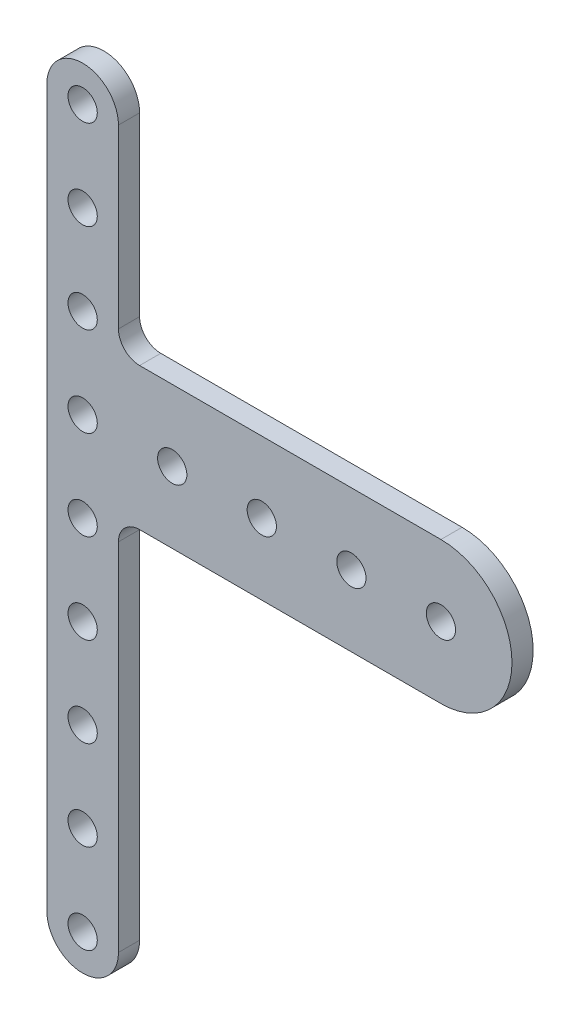
ISO-10303-21;
HEADER;
FILE_DESCRIPTION(('STEP AP214'),'2;1');
FILE_NAME('part.step','',(''),(''),'','','');
FILE_SCHEMA(('AUTOMOTIVE_DESIGN { 1 0 10303 214 1 1 1 1 }'));
ENDSEC;
DATA;
#1=APPLICATION_CONTEXT('core data for automotive mechanical design processes');
#2=APPLICATION_PROTOCOL_DEFINITION('international standard','automotive_design',2000,#1);
#3=PRODUCT_CONTEXT('',#1,'mechanical');
#4=PRODUCT('Part','Part','',(#3));
#5=PRODUCT_RELATED_PRODUCT_CATEGORY('part','',(#4));
#6=PRODUCT_DEFINITION_FORMATION('','',#4);
#7=PRODUCT_DEFINITION_CONTEXT('part definition',#1,'design');
#8=PRODUCT_DEFINITION('design','',#6,#7);
#9=PRODUCT_DEFINITION_SHAPE('','',#8);
#10=(LENGTH_UNIT() NAMED_UNIT(*) SI_UNIT(.MILLI.,.METRE.));
#11=(NAMED_UNIT(*) PLANE_ANGLE_UNIT() SI_UNIT($,.RADIAN.));
#12=(NAMED_UNIT(*) SI_UNIT($,.STERADIAN.) SOLID_ANGLE_UNIT());
#13=UNCERTAINTY_MEASURE_WITH_UNIT(LENGTH_MEASURE(1.E-05),#10,'distance_accuracy_value','');
#14=(GEOMETRIC_REPRESENTATION_CONTEXT(3) GLOBAL_UNCERTAINTY_ASSIGNED_CONTEXT((#13)) GLOBAL_UNIT_ASSIGNED_CONTEXT((#10,
#11,#12)) REPRESENTATION_CONTEXT('',''));
#15=CARTESIAN_POINT('',(0.,0.,0.));
#16=DIRECTION('',(0.,0.,1.));
#17=DIRECTION('',(1.,0.,0.));
#18=AXIS2_PLACEMENT_3D('',#15,#16,#17);
#19=CARTESIAN_POINT('',(-1.30692486857548E-13,38.1,1.5));
#20=DIRECTION('',(0.,0.,1.));
#21=DIRECTION('',(1.,0.,0.));
#22=AXIS2_PLACEMENT_3D('',#19,#20,#21);
#23=PLANE('',#22);
#24=CARTESIAN_POINT('',(5.28991153169859E-13,-50.8,1.5));
#25=DIRECTION('',(0.,0.,1.));
#26=DIRECTION('',(1.,0.,0.));
#27=AXIS2_PLACEMENT_3D('',#24,#25,#26);
#28=CIRCLE('',#27,2.075);
#29=CARTESIAN_POINT('',(2.07500000000053,-50.8,1.5));
#30=VERTEX_POINT('',#29);
#31=EDGE_CURVE('E287',#30,#30,#28,.T.);
#32=ORIENTED_EDGE('',*,*,#31,.F.);
#33=EDGE_LOOP('',(#32));
#34=FACE_BOUND('',#33,.T.);
#35=CARTESIAN_POINT('',(2.6449557658493E-13,-25.4,1.5));
#36=DIRECTION('',(0.,0.,1.));
#37=DIRECTION('',(1.,0.,0.));
#38=AXIS2_PLACEMENT_3D('',#35,#36,#37);
#39=CIRCLE('',#38,2.075);
#40=CARTESIAN_POINT('',(2.07500000000026,-25.4,1.5));
#41=VERTEX_POINT('',#40);
#42=EDGE_CURVE('E275',#41,#41,#39,.T.);
#43=ORIENTED_EDGE('',*,*,#42,.F.);
#44=EDGE_LOOP('',(#43));
#45=FACE_BOUND('',#44,.T.);
#46=CARTESIAN_POINT('',(-1.30692486857548E-13,38.1,1.5));
#47=DIRECTION('',(0.,0.,1.));
#48=DIRECTION('',(1.,0.,0.));
#49=AXIS2_PLACEMENT_3D('',#46,#47,#48);
#50=CIRCLE('',#49,2.075);
#51=CARTESIAN_POINT('',(2.07499999999987,38.1,1.5));
#52=VERTEX_POINT('',#51);
#53=EDGE_CURVE('E263',#52,#52,#50,.T.);
#54=ORIENTED_EDGE('',*,*,#53,.F.);
#55=EDGE_LOOP('',(#54));
#56=FACE_BOUND('',#55,.T.);
#57=CARTESIAN_POINT('',(0.,12.7,1.5));
#58=DIRECTION('',(0.,0.,1.));
#59=DIRECTION('',(1.,0.,0.));
#60=AXIS2_PLACEMENT_3D('',#57,#58,#59);
#61=CIRCLE('',#60,2.075);
#62=CARTESIAN_POINT('',(2.07499999999996,12.7,1.5));
#63=VERTEX_POINT('',#62);
#64=EDGE_CURVE('E251',#63,#63,#61,.T.);
#65=ORIENTED_EDGE('',*,*,#64,.F.);
#66=EDGE_LOOP('',(#65));
#67=FACE_BOUND('',#66,.T.);
#68=CARTESIAN_POINT('',(38.1,0.,1.5));
#69=DIRECTION('',(0.,0.,1.));
#70=DIRECTION('',(1.,0.,0.));
#71=AXIS2_PLACEMENT_3D('',#68,#69,#70);
#72=CIRCLE('',#71,2.075);
#73=CARTESIAN_POINT('',(40.175,0.,1.5));
#74=VERTEX_POINT('',#73);
#75=EDGE_CURVE('E239',#74,#74,#72,.T.);
#76=ORIENTED_EDGE('',*,*,#75,.F.);
#77=EDGE_LOOP('',(#76));
#78=FACE_BOUND('',#77,.T.);
#79=CARTESIAN_POINT('',(12.7,0.,1.5));
#80=DIRECTION('',(0.,0.,1.));
#81=DIRECTION('',(1.,0.,0.));
#82=AXIS2_PLACEMENT_3D('',#79,#80,#81);
#83=CIRCLE('',#82,2.075);
#84=CARTESIAN_POINT('',(14.775,0.,1.5));
#85=VERTEX_POINT('',#84);
#86=EDGE_CURVE('E227',#85,#85,#83,.T.);
#87=ORIENTED_EDGE('',*,*,#86,.F.);
#88=EDGE_LOOP('',(#87));
#89=FACE_BOUND('',#88,.T.);
#90=CARTESIAN_POINT('',(-1.30692486857548E-13,38.1,1.5));
#91=DIRECTION('',(0.,0.,1.));
#92=DIRECTION('',(1.,0.,0.));
#93=AXIS2_PLACEMENT_3D('',#90,#91,#92);
#94=CIRCLE('',#93,5.075);
#95=CARTESIAN_POINT('',(5.07499999999987,38.1,1.5));
#96=VERTEX_POINT('',#95);
#97=CARTESIAN_POINT('',(-5.07500000000013,38.1,1.5));
#98=VERTEX_POINT('',#97);
#99=EDGE_CURVE('E125',#96,#98,#94,.T.);
#100=ORIENTED_EDGE('',*,*,#99,.T.);
#101=DIRECTION('',(0.,-1.,0.));
#102=VECTOR('',#101,1.);
#103=CARTESIAN_POINT('',(-5.07500000000013,38.1,1.5));
#104=LINE('',#103,#102);
#105=CARTESIAN_POINT('',(-5.07499999999934,-63.5,1.5));
#106=VERTEX_POINT('',#105);
#107=EDGE_CURVE('E114',#98,#106,#104,.T.);
#108=ORIENTED_EDGE('',*,*,#107,.T.);
#109=CARTESIAN_POINT('',(6.61238941462324E-13,-63.5,1.5));
#110=DIRECTION('',(0.,0.,1.));
#111=DIRECTION('',(1.,0.,0.));
#112=AXIS2_PLACEMENT_3D('',#109,#110,#111);
#113=CIRCLE('',#112,5.075);
#114=CARTESIAN_POINT('',(5.07500000000066,-63.5,1.5));
#115=VERTEX_POINT('',#114);
#116=EDGE_CURVE('E124',#106,#115,#113,.T.);
#117=ORIENTED_EDGE('',*,*,#116,.T.);
#118=DIRECTION('',(0.,1.,0.));
#119=VECTOR('',#118,1.);
#120=CARTESIAN_POINT('',(5.07500000000066,-63.5,1.5));
#121=LINE('',#120,#119);
#122=CARTESIAN_POINT('',(5.07500000000027,-13.075,1.5));
#123=VERTEX_POINT('',#122);
#124=EDGE_CURVE('E162',#115,#123,#121,.T.);
#125=ORIENTED_EDGE('',*,*,#124,.T.);
#126=CARTESIAN_POINT('',(8.07500000000027,-13.075,1.5));
#127=DIRECTION('',(0.,0.,1.));
#128=DIRECTION('',(1.,0.,0.));
#129=AXIS2_PLACEMENT_3D('',#126,#127,#128);
#130=CIRCLE('',#129,3.);
#131=CARTESIAN_POINT('',(8.07500000000027,-10.075,1.5));
#132=VERTEX_POINT('',#131);
#133=EDGE_CURVE('E155',#123,#132,#130,.F.);
#134=ORIENTED_EDGE('',*,*,#133,.T.);
#135=DIRECTION('',(1.,0.,0.));
#136=VECTOR('',#135,1.);
#137=CARTESIAN_POINT('',(50.8,-10.075,1.5));
#138=LINE('',#137,#136);
#139=CARTESIAN_POINT('',(50.8,-10.075,1.5));
#140=VERTEX_POINT('',#139);
#141=EDGE_CURVE('E159',#132,#140,#138,.T.);
#142=ORIENTED_EDGE('',*,*,#141,.T.);
#143=CARTESIAN_POINT('',(50.8,0.,1.5));
#144=DIRECTION('',(0.,0.,1.));
#145=DIRECTION('',(1.,0.,0.));
#146=AXIS2_PLACEMENT_3D('',#143,#144,#145);
#147=CIRCLE('',#146,10.075);
#148=CARTESIAN_POINT('',(50.8,10.075,1.5));
#149=VERTEX_POINT('',#148);
#150=EDGE_CURVE('E172',#140,#149,#147,.T.);
#151=ORIENTED_EDGE('',*,*,#150,.T.);
#152=DIRECTION('',(-1.,0.,0.));
#153=VECTOR('',#152,1.);
#154=CARTESIAN_POINT('',(50.8,10.075,1.5));
#155=LINE('',#154,#153);
#156=CARTESIAN_POINT('',(8.07500000000007,10.075,1.5));
#157=VERTEX_POINT('',#156);
#158=EDGE_CURVE('E211',#149,#157,#155,.T.);
#159=ORIENTED_EDGE('',*,*,#158,.T.);
#160=CARTESIAN_POINT('',(8.07500000000007,13.075,1.5));
#161=DIRECTION('',(0.,0.,1.));
#162=DIRECTION('',(1.,0.,0.));
#163=AXIS2_PLACEMENT_3D('',#160,#161,#162);
#164=CIRCLE('',#163,3.);
#165=CARTESIAN_POINT('',(5.07500000000007,13.075,1.5));
#166=VERTEX_POINT('',#165);
#167=EDGE_CURVE('E11',#157,#166,#164,.F.);
#168=ORIENTED_EDGE('',*,*,#167,.T.);
#169=DIRECTION('',(0.,1.,0.));
#170=VECTOR('',#169,1.);
#171=CARTESIAN_POINT('',(5.07500000000009,10.075,1.5));
#172=LINE('',#171,#170);
#173=EDGE_CURVE('E130',#166,#96,#172,.T.);
#174=ORIENTED_EDGE('',*,*,#173,.T.);
#175=EDGE_LOOP('',(#100,#108,#117,#125,#134,#142,#151,#159,#168,#174));
#176=FACE_BOUND('',#175,.T.);
#177=CARTESIAN_POINT('',(0.,0.,1.5));
#178=DIRECTION('',(0.,0.,1.));
#179=DIRECTION('',(1.,0.,0.));
#180=AXIS2_PLACEMENT_3D('',#177,#178,#179);
#181=CIRCLE('',#180,2.075);
#182=CARTESIAN_POINT('',(2.075,0.,1.5));
#183=VERTEX_POINT('',#182);
#184=EDGE_CURVE('E218',#183,#183,#181,.T.);
#185=ORIENTED_EDGE('',*,*,#184,.F.);
#186=EDGE_LOOP('',(#185));
#187=FACE_BOUND('',#186,.T.);
#188=CARTESIAN_POINT('',(25.4,0.,1.5));
#189=DIRECTION('',(0.,0.,1.));
#190=DIRECTION('',(1.,0.,0.));
#191=AXIS2_PLACEMENT_3D('',#188,#189,#190);
#192=CIRCLE('',#191,2.075);
#193=CARTESIAN_POINT('',(27.475,0.,1.5));
#194=VERTEX_POINT('',#193);
#195=EDGE_CURVE('E233',#194,#194,#192,.T.);
#196=ORIENTED_EDGE('',*,*,#195,.F.);
#197=EDGE_LOOP('',(#196));
#198=FACE_BOUND('',#197,.T.);
#199=CARTESIAN_POINT('',(50.8,0.,1.5));
#200=DIRECTION('',(0.,0.,1.));
#201=DIRECTION('',(1.,0.,0.));
#202=AXIS2_PLACEMENT_3D('',#199,#200,#201);
#203=CIRCLE('',#202,2.075);
#204=CARTESIAN_POINT('',(52.875,0.,1.5));
#205=VERTEX_POINT('',#204);
#206=EDGE_CURVE('E245',#205,#205,#203,.T.);
#207=ORIENTED_EDGE('',*,*,#206,.F.);
#208=EDGE_LOOP('',(#207));
#209=FACE_BOUND('',#208,.T.);
#210=CARTESIAN_POINT('',(0.,25.4,1.5));
#211=DIRECTION('',(0.,0.,1.));
#212=DIRECTION('',(1.,0.,0.));
#213=AXIS2_PLACEMENT_3D('',#210,#211,#212);
#214=CIRCLE('',#213,2.075);
#215=CARTESIAN_POINT('',(2.07499999999991,25.4,1.5));
#216=VERTEX_POINT('',#215);
#217=EDGE_CURVE('E257',#216,#216,#214,.T.);
#218=ORIENTED_EDGE('',*,*,#217,.F.);
#219=EDGE_LOOP('',(#218));
#220=FACE_BOUND('',#219,.T.);
#221=CARTESIAN_POINT('',(1.32247788292465E-13,-12.7,1.5));
#222=DIRECTION('',(0.,0.,1.));
#223=DIRECTION('',(1.,0.,0.));
#224=AXIS2_PLACEMENT_3D('',#221,#222,#223);
#225=CIRCLE('',#224,2.075);
#226=CARTESIAN_POINT('',(2.07500000000013,-12.7,1.5));
#227=VERTEX_POINT('',#226);
#228=EDGE_CURVE('E269',#227,#227,#225,.T.);
#229=ORIENTED_EDGE('',*,*,#228,.F.);
#230=EDGE_LOOP('',(#229));
#231=FACE_BOUND('',#230,.T.);
#232=CARTESIAN_POINT('',(3.96743364877394E-13,-38.1,1.5));
#233=DIRECTION('',(0.,0.,1.));
#234=DIRECTION('',(1.,0.,0.));
#235=AXIS2_PLACEMENT_3D('',#232,#233,#234);
#236=CIRCLE('',#235,2.075);
#237=CARTESIAN_POINT('',(2.0750000000004,-38.1,1.5));
#238=VERTEX_POINT('',#237);
#239=EDGE_CURVE('E281',#238,#238,#236,.T.);
#240=ORIENTED_EDGE('',*,*,#239,.F.);
#241=EDGE_LOOP('',(#240));
#242=FACE_BOUND('',#241,.T.);
#243=CARTESIAN_POINT('',(6.61238941462324E-13,-63.5,1.5));
#244=DIRECTION('',(0.,0.,1.));
#245=DIRECTION('',(1.,0.,0.));
#246=AXIS2_PLACEMENT_3D('',#243,#244,#245);
#247=CIRCLE('',#246,2.075);
#248=CARTESIAN_POINT('',(2.07500000000066,-63.5,1.5));
#249=VERTEX_POINT('',#248);
#250=EDGE_CURVE('E293',#249,#249,#247,.T.);
#251=ORIENTED_EDGE('',*,*,#250,.F.);
#252=EDGE_LOOP('',(#251));
#253=FACE_BOUND('',#252,.T.);
#254=ADVANCED_FACE('F37',(#34,#45,#56,#67,#78,#89,#176,#187,#198,#209,#220,#231,#242,#253),#23,.T.);
#255=CARTESIAN_POINT('',(-1.30692486857548E-13,38.1,-1.5));
#256=DIRECTION('',(0.,0.,1.));
#257=DIRECTION('',(1.,0.,0.));
#258=AXIS2_PLACEMENT_3D('',#255,#256,#257);
#259=PLANE('',#258);
#260=CARTESIAN_POINT('',(-1.30692486857548E-13,38.1,-1.5));
#261=DIRECTION('',(0.,0.,1.));
#262=DIRECTION('',(1.,0.,0.));
#263=AXIS2_PLACEMENT_3D('',#260,#261,#262);
#264=CIRCLE('',#263,5.075);
#265=CARTESIAN_POINT('',(5.07499999999987,38.1,-1.5));
#266=VERTEX_POINT('',#265);
#267=CARTESIAN_POINT('',(-5.07500000000013,38.1,-1.5));
#268=VERTEX_POINT('',#267);
#269=EDGE_CURVE('E138',#266,#268,#264,.T.);
#270=ORIENTED_EDGE('',*,*,#269,.F.);
#271=DIRECTION('',(0.,1.,0.));
#272=VECTOR('',#271,1.);
#273=CARTESIAN_POINT('',(5.07500000000009,10.075,-1.5));
#274=LINE('',#273,#272);
#275=CARTESIAN_POINT('',(5.07500000000007,13.075,-1.5));
#276=VERTEX_POINT('',#275);
#277=EDGE_CURVE('E134',#276,#266,#274,.T.);
#278=ORIENTED_EDGE('',*,*,#277,.F.);
#279=CARTESIAN_POINT('',(8.07500000000007,13.075,-1.5));
#280=DIRECTION('',(0.,0.,1.));
#281=DIRECTION('',(1.,0.,0.));
#282=AXIS2_PLACEMENT_3D('',#279,#280,#281);
#283=CIRCLE('',#282,3.);
#284=CARTESIAN_POINT('',(8.07500000000007,10.075,-1.5));
#285=VERTEX_POINT('',#284);
#286=EDGE_CURVE('E45',#276,#285,#283,.T.);
#287=ORIENTED_EDGE('',*,*,#286,.T.);
#288=DIRECTION('',(-1.,0.,0.));
#289=VECTOR('',#288,1.);
#290=CARTESIAN_POINT('',(50.8,10.075,-1.5));
#291=LINE('',#290,#289);
#292=CARTESIAN_POINT('',(50.8,10.075,-1.5));
#293=VERTEX_POINT('',#292);
#294=EDGE_CURVE('E196',#293,#285,#291,.T.);
#295=ORIENTED_EDGE('',*,*,#294,.F.);
#296=CARTESIAN_POINT('',(50.8,0.,-1.5));
#297=DIRECTION('',(0.,0.,1.));
#298=DIRECTION('',(1.,0.,0.));
#299=AXIS2_PLACEMENT_3D('',#296,#297,#298);
#300=CIRCLE('',#299,10.075);
#301=CARTESIAN_POINT('',(50.8,-10.075,-1.5));
#302=VERTEX_POINT('',#301);
#303=EDGE_CURVE('E189',#302,#293,#300,.T.);
#304=ORIENTED_EDGE('',*,*,#303,.F.);
#305=DIRECTION('',(1.,0.,0.));
#306=VECTOR('',#305,1.);
#307=CARTESIAN_POINT('',(50.8,-10.075,-1.5));
#308=LINE('',#307,#306);
#309=CARTESIAN_POINT('',(8.07500000000027,-10.075,-1.5));
#310=VERTEX_POINT('',#309);
#311=EDGE_CURVE('E182',#310,#302,#308,.T.);
#312=ORIENTED_EDGE('',*,*,#311,.F.);
#313=CARTESIAN_POINT('',(8.07500000000027,-13.075,-1.5));
#314=DIRECTION('',(0.,0.,1.));
#315=DIRECTION('',(1.,0.,0.));
#316=AXIS2_PLACEMENT_3D('',#313,#314,#315);
#317=CIRCLE('',#316,3.);
#318=CARTESIAN_POINT('',(5.07500000000027,-13.075,-1.5));
#319=VERTEX_POINT('',#318);
#320=EDGE_CURVE('E153',#310,#319,#317,.T.);
#321=ORIENTED_EDGE('',*,*,#320,.T.);
#322=DIRECTION('',(0.,1.,0.));
#323=VECTOR('',#322,1.);
#324=CARTESIAN_POINT('',(5.07500000000066,-63.5,-1.5));
#325=LINE('',#324,#323);
#326=CARTESIAN_POINT('',(5.07500000000066,-63.5,-1.5));
#327=VERTEX_POINT('',#326);
#328=EDGE_CURVE('E180',#327,#319,#325,.T.);
#329=ORIENTED_EDGE('',*,*,#328,.F.);
#330=CARTESIAN_POINT('',(6.61238941462324E-13,-63.5,-1.5));
#331=DIRECTION('',(0.,0.,1.));
#332=DIRECTION('',(1.,0.,0.));
#333=AXIS2_PLACEMENT_3D('',#330,#331,#332);
#334=CIRCLE('',#333,5.075);
#335=CARTESIAN_POINT('',(-5.07499999999934,-63.5,-1.5));
#336=VERTEX_POINT('',#335);
#337=EDGE_CURVE('E187',#336,#327,#334,.T.);
#338=ORIENTED_EDGE('',*,*,#337,.F.);
#339=DIRECTION('',(0.,-1.,0.));
#340=VECTOR('',#339,1.);
#341=CARTESIAN_POINT('',(-5.07500000000013,38.1,-1.5));
#342=LINE('',#341,#340);
#343=EDGE_CURVE('E191',#268,#336,#342,.T.);
#344=ORIENTED_EDGE('',*,*,#343,.F.);
#345=EDGE_LOOP('',(#270,#278,#287,#295,#304,#312,#321,#329,#338,#344));
#346=FACE_BOUND('',#345,.T.);
#347=CARTESIAN_POINT('',(0.,0.,-1.5));
#348=DIRECTION('',(0.,0.,1.));
#349=DIRECTION('',(1.,0.,0.));
#350=AXIS2_PLACEMENT_3D('',#347,#348,#349);
#351=CIRCLE('',#350,2.075);
#352=CARTESIAN_POINT('',(2.075,0.,-1.5));
#353=VERTEX_POINT('',#352);
#354=EDGE_CURVE('E224',#353,#353,#351,.T.);
#355=ORIENTED_EDGE('',*,*,#354,.T.);
#356=EDGE_LOOP('',(#355));
#357=FACE_BOUND('',#356,.T.);
#358=CARTESIAN_POINT('',(12.7,0.,-1.5));
#359=DIRECTION('',(0.,0.,1.));
#360=DIRECTION('',(1.,0.,0.));
#361=AXIS2_PLACEMENT_3D('',#358,#359,#360);
#362=CIRCLE('',#361,2.075);
#363=CARTESIAN_POINT('',(14.775,0.,-1.5));
#364=VERTEX_POINT('',#363);
#365=EDGE_CURVE('E230',#364,#364,#362,.T.);
#366=ORIENTED_EDGE('',*,*,#365,.T.);
#367=EDGE_LOOP('',(#366));
#368=FACE_BOUND('',#367,.T.);
#369=CARTESIAN_POINT('',(25.4,0.,-1.5));
#370=DIRECTION('',(0.,0.,1.));
#371=DIRECTION('',(1.,0.,0.));
#372=AXIS2_PLACEMENT_3D('',#369,#370,#371);
#373=CIRCLE('',#372,2.075);
#374=CARTESIAN_POINT('',(27.475,0.,-1.5));
#375=VERTEX_POINT('',#374);
#376=EDGE_CURVE('E236',#375,#375,#373,.T.);
#377=ORIENTED_EDGE('',*,*,#376,.T.);
#378=EDGE_LOOP('',(#377));
#379=FACE_BOUND('',#378,.T.);
#380=CARTESIAN_POINT('',(38.1,0.,-1.5));
#381=DIRECTION('',(0.,0.,1.));
#382=DIRECTION('',(1.,0.,0.));
#383=AXIS2_PLACEMENT_3D('',#380,#381,#382);
#384=CIRCLE('',#383,2.075);
#385=CARTESIAN_POINT('',(40.175,0.,-1.5));
#386=VERTEX_POINT('',#385);
#387=EDGE_CURVE('E242',#386,#386,#384,.T.);
#388=ORIENTED_EDGE('',*,*,#387,.T.);
#389=EDGE_LOOP('',(#388));
#390=FACE_BOUND('',#389,.T.);
#391=CARTESIAN_POINT('',(50.8,0.,-1.5));
#392=DIRECTION('',(0.,0.,1.));
#393=DIRECTION('',(1.,0.,0.));
#394=AXIS2_PLACEMENT_3D('',#391,#392,#393);
#395=CIRCLE('',#394,2.075);
#396=CARTESIAN_POINT('',(52.875,0.,-1.5));
#397=VERTEX_POINT('',#396);
#398=EDGE_CURVE('E248',#397,#397,#395,.T.);
#399=ORIENTED_EDGE('',*,*,#398,.T.);
#400=EDGE_LOOP('',(#399));
#401=FACE_BOUND('',#400,.T.);
#402=CARTESIAN_POINT('',(0.,12.7,-1.5));
#403=DIRECTION('',(0.,0.,1.));
#404=DIRECTION('',(1.,0.,0.));
#405=AXIS2_PLACEMENT_3D('',#402,#403,#404);
#406=CIRCLE('',#405,2.075);
#407=CARTESIAN_POINT('',(2.07499999999996,12.7,-1.5));
#408=VERTEX_POINT('',#407);
#409=EDGE_CURVE('E254',#408,#408,#406,.T.);
#410=ORIENTED_EDGE('',*,*,#409,.T.);
#411=EDGE_LOOP('',(#410));
#412=FACE_BOUND('',#411,.T.);
#413=CARTESIAN_POINT('',(0.,25.4,-1.5));
#414=DIRECTION('',(0.,0.,1.));
#415=DIRECTION('',(1.,0.,0.));
#416=AXIS2_PLACEMENT_3D('',#413,#414,#415);
#417=CIRCLE('',#416,2.075);
#418=CARTESIAN_POINT('',(2.07499999999991,25.4,-1.5));
#419=VERTEX_POINT('',#418);
#420=EDGE_CURVE('E260',#419,#419,#417,.T.);
#421=ORIENTED_EDGE('',*,*,#420,.T.);
#422=EDGE_LOOP('',(#421));
#423=FACE_BOUND('',#422,.T.);
#424=CARTESIAN_POINT('',(-1.30692486857548E-13,38.1,-1.5));
#425=DIRECTION('',(0.,0.,1.));
#426=DIRECTION('',(1.,0.,0.));
#427=AXIS2_PLACEMENT_3D('',#424,#425,#426);
#428=CIRCLE('',#427,2.075);
#429=CARTESIAN_POINT('',(2.07499999999987,38.1,-1.5));
#430=VERTEX_POINT('',#429);
#431=EDGE_CURVE('E266',#430,#430,#428,.T.);
#432=ORIENTED_EDGE('',*,*,#431,.T.);
#433=EDGE_LOOP('',(#432));
#434=FACE_BOUND('',#433,.T.);
#435=CARTESIAN_POINT('',(1.32247788292465E-13,-12.7,-1.5));
#436=DIRECTION('',(0.,0.,1.));
#437=DIRECTION('',(1.,0.,0.));
#438=AXIS2_PLACEMENT_3D('',#435,#436,#437);
#439=CIRCLE('',#438,2.075);
#440=CARTESIAN_POINT('',(2.07500000000013,-12.7,-1.5));
#441=VERTEX_POINT('',#440);
#442=EDGE_CURVE('E272',#441,#441,#439,.T.);
#443=ORIENTED_EDGE('',*,*,#442,.T.);
#444=EDGE_LOOP('',(#443));
#445=FACE_BOUND('',#444,.T.);
#446=CARTESIAN_POINT('',(2.6449557658493E-13,-25.4,-1.5));
#447=DIRECTION('',(0.,0.,1.));
#448=DIRECTION('',(1.,0.,0.));
#449=AXIS2_PLACEMENT_3D('',#446,#447,#448);
#450=CIRCLE('',#449,2.075);
#451=CARTESIAN_POINT('',(2.07500000000026,-25.4,-1.5));
#452=VERTEX_POINT('',#451);
#453=EDGE_CURVE('E278',#452,#452,#450,.T.);
#454=ORIENTED_EDGE('',*,*,#453,.T.);
#455=EDGE_LOOP('',(#454));
#456=FACE_BOUND('',#455,.T.);
#457=CARTESIAN_POINT('',(3.96743364877394E-13,-38.1,-1.5));
#458=DIRECTION('',(0.,0.,1.));
#459=DIRECTION('',(1.,0.,0.));
#460=AXIS2_PLACEMENT_3D('',#457,#458,#459);
#461=CIRCLE('',#460,2.075);
#462=CARTESIAN_POINT('',(2.0750000000004,-38.1,-1.5));
#463=VERTEX_POINT('',#462);
#464=EDGE_CURVE('E284',#463,#463,#461,.T.);
#465=ORIENTED_EDGE('',*,*,#464,.T.);
#466=EDGE_LOOP('',(#465));
#467=FACE_BOUND('',#466,.T.);
#468=CARTESIAN_POINT('',(5.28991153169859E-13,-50.8,-1.5));
#469=DIRECTION('',(0.,0.,1.));
#470=DIRECTION('',(1.,0.,0.));
#471=AXIS2_PLACEMENT_3D('',#468,#469,#470);
#472=CIRCLE('',#471,2.075);
#473=CARTESIAN_POINT('',(2.07500000000053,-50.8,-1.5));
#474=VERTEX_POINT('',#473);
#475=EDGE_CURVE('E290',#474,#474,#472,.T.);
#476=ORIENTED_EDGE('',*,*,#475,.T.);
#477=EDGE_LOOP('',(#476));
#478=FACE_BOUND('',#477,.T.);
#479=CARTESIAN_POINT('',(6.61238941462324E-13,-63.5,-1.5));
#480=DIRECTION('',(0.,0.,1.));
#481=DIRECTION('',(1.,0.,0.));
#482=AXIS2_PLACEMENT_3D('',#479,#480,#481);
#483=CIRCLE('',#482,2.075);
#484=CARTESIAN_POINT('',(2.07500000000066,-63.5,-1.5));
#485=VERTEX_POINT('',#484);
#486=EDGE_CURVE('E296',#485,#485,#483,.T.);
#487=ORIENTED_EDGE('',*,*,#486,.T.);
#488=EDGE_LOOP('',(#487));
#489=FACE_BOUND('',#488,.T.);
#490=ADVANCED_FACE('F177',(#346,#357,#368,#379,#390,#401,#412,#423,#434,#445,#456,#467,#478,
#489),#259,.F.);
#491=CARTESIAN_POINT('',(-1.30692486857548E-13,38.1,1.5));
#492=DIRECTION('',(0.,0.,-1.));
#493=DIRECTION('',(-1.,0.,0.));
#494=AXIS2_PLACEMENT_3D('',#491,#492,#493);
#495=CYLINDRICAL_SURFACE('',#494,5.075);
#496=ORIENTED_EDGE('',*,*,#269,.T.);
#497=DIRECTION('',(0.,0.,-1.));
#498=VECTOR('',#497,1.);
#499=CARTESIAN_POINT('',(-5.07500000000013,38.1,1.5));
#500=LINE('',#499,#498);
#501=EDGE_CURVE('E118',#98,#268,#500,.T.);
#502=ORIENTED_EDGE('',*,*,#501,.F.);
#503=ORIENTED_EDGE('',*,*,#99,.F.);
#504=DIRECTION('',(0.,0.,-1.));
#505=VECTOR('',#504,1.);
#506=CARTESIAN_POINT('',(5.07499999999987,38.1,1.5));
#507=LINE('',#506,#505);
#508=EDGE_CURVE('E199',#96,#266,#507,.T.);
#509=ORIENTED_EDGE('',*,*,#508,.T.);
#510=EDGE_LOOP('',(#496,#502,#503,#509));
#511=FACE_BOUND('',#510,.T.);
#512=ADVANCED_FACE('F136',(#511),#495,.T.);
#513=CARTESIAN_POINT('',(-5.07500000000013,38.1,1.5));
#514=DIRECTION('',(1.,0.,0.));
#515=DIRECTION('',(0.,1.,0.));
#516=AXIS2_PLACEMENT_3D('',#513,#514,#515);
#517=PLANE('',#516);
#518=ORIENTED_EDGE('',*,*,#343,.T.);
#519=DIRECTION('',(0.,0.,-1.));
#520=VECTOR('',#519,1.);
#521=CARTESIAN_POINT('',(-5.07499999999934,-63.5,1.5));
#522=LINE('',#521,#520);
#523=EDGE_CURVE('E121',#106,#336,#522,.T.);
#524=ORIENTED_EDGE('',*,*,#523,.F.);
#525=ORIENTED_EDGE('',*,*,#107,.F.);
#526=ORIENTED_EDGE('',*,*,#501,.T.);
#527=EDGE_LOOP('',(#518,#524,#525,#526));
#528=FACE_BOUND('',#527,.T.);
#529=ADVANCED_FACE('F116',(#528),#517,.F.);
#530=CARTESIAN_POINT('',(6.61238941462324E-13,-63.5,1.5));
#531=DIRECTION('',(0.,0.,-1.));
#532=DIRECTION('',(-1.,0.,0.));
#533=AXIS2_PLACEMENT_3D('',#530,#531,#532);
#534=CYLINDRICAL_SURFACE('',#533,5.075);
#535=ORIENTED_EDGE('',*,*,#337,.T.);
#536=DIRECTION('',(0.,0.,-1.));
#537=VECTOR('',#536,1.);
#538=CARTESIAN_POINT('',(5.07500000000066,-63.5,1.5));
#539=LINE('',#538,#537);
#540=EDGE_CURVE('E144',#115,#327,#539,.T.);
#541=ORIENTED_EDGE('',*,*,#540,.F.);
#542=ORIENTED_EDGE('',*,*,#116,.F.);
#543=ORIENTED_EDGE('',*,*,#523,.T.);
#544=EDGE_LOOP('',(#535,#541,#542,#543));
#545=FACE_BOUND('',#544,.T.);
#546=ADVANCED_FACE('F220',(#545),#534,.T.);
#547=CARTESIAN_POINT('',(5.07500000000066,-63.5,1.5));
#548=DIRECTION('',(-1.,0.,0.));
#549=DIRECTION('',(0.,-1.,0.));
#550=AXIS2_PLACEMENT_3D('',#547,#548,#549);
#551=PLANE('',#550);
#552=ORIENTED_EDGE('',*,*,#328,.T.);
#553=DIRECTION('',(0.,0.,-1.));
#554=VECTOR('',#553,1.);
#555=CARTESIAN_POINT('',(5.07500000000027,-13.075,1.5));
#556=LINE('',#555,#554);
#557=EDGE_CURVE('E142',#319,#123,#556,.F.);
#558=ORIENTED_EDGE('',*,*,#557,.T.);
#559=ORIENTED_EDGE('',*,*,#124,.F.);
#560=ORIENTED_EDGE('',*,*,#540,.T.);
#561=EDGE_LOOP('',(#552,#558,#559,#560));
#562=FACE_BOUND('',#561,.T.);
#563=ADVANCED_FACE('F185',(#562),#551,.F.);
#564=CARTESIAN_POINT('',(50.8,-10.075,1.5));
#565=DIRECTION('',(0.,1.,0.));
#566=DIRECTION('',(0.,0.,1.));
#567=AXIS2_PLACEMENT_3D('',#564,#565,#566);
#568=PLANE('',#567);
#569=ORIENTED_EDGE('',*,*,#141,.F.);
#570=DIRECTION('',(0.,0.,-1.));
#571=VECTOR('',#570,1.);
#572=CARTESIAN_POINT('',(8.07500000000027,-10.075,-1.5));
#573=LINE('',#572,#571);
#574=EDGE_CURVE('E139',#132,#310,#573,.T.);
#575=ORIENTED_EDGE('',*,*,#574,.T.);
#576=ORIENTED_EDGE('',*,*,#311,.T.);
#577=DIRECTION('',(0.,0.,-1.));
#578=VECTOR('',#577,1.);
#579=CARTESIAN_POINT('',(50.8,-10.075,1.5));
#580=LINE('',#579,#578);
#581=EDGE_CURVE('E170',#140,#302,#580,.T.);
#582=ORIENTED_EDGE('',*,*,#581,.F.);
#583=EDGE_LOOP('',(#569,#575,#576,#582));
#584=FACE_BOUND('',#583,.T.);
#585=ADVANCED_FACE('F167',(#584),#568,.F.);
#586=CARTESIAN_POINT('',(50.8,0.,1.5));
#587=DIRECTION('',(0.,0.,-1.));
#588=DIRECTION('',(-1.,0.,0.));
#589=AXIS2_PLACEMENT_3D('',#586,#587,#588);
#590=CYLINDRICAL_SURFACE('',#589,10.075);
#591=ORIENTED_EDGE('',*,*,#303,.T.);
#592=DIRECTION('',(0.,0.,-1.));
#593=VECTOR('',#592,1.);
#594=CARTESIAN_POINT('',(50.8,10.075,1.5));
#595=LINE('',#594,#593);
#596=EDGE_CURVE('E201',#149,#293,#595,.T.);
#597=ORIENTED_EDGE('',*,*,#596,.F.);
#598=ORIENTED_EDGE('',*,*,#150,.F.);
#599=ORIENTED_EDGE('',*,*,#581,.T.);
#600=EDGE_LOOP('',(#591,#597,#598,#599));
#601=FACE_BOUND('',#600,.T.);
#602=ADVANCED_FACE('F205',(#601),#590,.T.);
#603=CARTESIAN_POINT('',(50.8,10.075,1.5));
#604=DIRECTION('',(0.,-1.,0.));
#605=DIRECTION('',(0.,0.,-1.));
#606=AXIS2_PLACEMENT_3D('',#603,#604,#605);
#607=PLANE('',#606);
#608=ORIENTED_EDGE('',*,*,#294,.T.);
#609=DIRECTION('',(0.,0.,-1.));
#610=VECTOR('',#609,1.);
#611=CARTESIAN_POINT('',(8.07500000000007,10.075,1.5));
#612=LINE('',#611,#610);
#613=EDGE_CURVE('E52',#285,#157,#612,.F.);
#614=ORIENTED_EDGE('',*,*,#613,.T.);
#615=ORIENTED_EDGE('',*,*,#158,.F.);
#616=ORIENTED_EDGE('',*,*,#596,.T.);
#617=EDGE_LOOP('',(#608,#614,#615,#616));
#618=FACE_BOUND('',#617,.T.);
#619=ADVANCED_FACE('F207',(#618),#607,.F.);
#620=CARTESIAN_POINT('',(5.07500000000009,10.075,1.5));
#621=DIRECTION('',(-1.,0.,0.));
#622=DIRECTION('',(0.,-1.,0.));
#623=AXIS2_PLACEMENT_3D('',#620,#621,#622);
#624=PLANE('',#623);
#625=ORIENTED_EDGE('',*,*,#173,.F.);
#626=DIRECTION('',(0.,0.,-1.));
#627=VECTOR('',#626,1.);
#628=CARTESIAN_POINT('',(5.07500000000007,13.075,-1.5));
#629=LINE('',#628,#627);
#630=EDGE_CURVE('E149',#166,#276,#629,.T.);
#631=ORIENTED_EDGE('',*,*,#630,.T.);
#632=ORIENTED_EDGE('',*,*,#277,.T.);
#633=ORIENTED_EDGE('',*,*,#508,.F.);
#634=EDGE_LOOP('',(#625,#631,#632,#633));
#635=FACE_BOUND('',#634,.T.);
#636=ADVANCED_FACE('F213',(#635),#624,.F.);
#637=CARTESIAN_POINT('',(0.,0.,1.5));
#638=DIRECTION('',(0.,0.,-1.));
#639=DIRECTION('',(-1.,0.,0.));
#640=AXIS2_PLACEMENT_3D('',#637,#638,#639);
#641=CYLINDRICAL_SURFACE('',#640,2.075);
#642=ORIENTED_EDGE('',*,*,#184,.T.);
#643=EDGE_LOOP('',(#642));
#644=FACE_BOUND('',#643,.T.);
#645=ORIENTED_EDGE('',*,*,#354,.F.);
#646=EDGE_LOOP('',(#645));
#647=FACE_BOUND('',#646,.T.);
#648=ADVANCED_FACE('F315',(#644,#647),#641,.F.);
#649=CARTESIAN_POINT('',(12.7,0.,1.5));
#650=DIRECTION('',(0.,0.,-1.));
#651=DIRECTION('',(-1.,0.,0.));
#652=AXIS2_PLACEMENT_3D('',#649,#650,#651);
#653=CYLINDRICAL_SURFACE('',#652,2.075);
#654=ORIENTED_EDGE('',*,*,#86,.T.);
#655=EDGE_LOOP('',(#654));
#656=FACE_BOUND('',#655,.T.);
#657=ORIENTED_EDGE('',*,*,#365,.F.);
#658=EDGE_LOOP('',(#657));
#659=FACE_BOUND('',#658,.T.);
#660=ADVANCED_FACE('F380',(#656,#659),#653,.F.);
#661=CARTESIAN_POINT('',(25.4,0.,1.5));
#662=DIRECTION('',(0.,0.,-1.));
#663=DIRECTION('',(-1.,0.,0.));
#664=AXIS2_PLACEMENT_3D('',#661,#662,#663);
#665=CYLINDRICAL_SURFACE('',#664,2.075);
#666=ORIENTED_EDGE('',*,*,#195,.T.);
#667=EDGE_LOOP('',(#666));
#668=FACE_BOUND('',#667,.T.);
#669=ORIENTED_EDGE('',*,*,#376,.F.);
#670=EDGE_LOOP('',(#669));
#671=FACE_BOUND('',#670,.T.);
#672=ADVANCED_FACE('F377',(#668,#671),#665,.F.);
#673=CARTESIAN_POINT('',(38.1,0.,1.5));
#674=DIRECTION('',(0.,0.,-1.));
#675=DIRECTION('',(-1.,0.,0.));
#676=AXIS2_PLACEMENT_3D('',#673,#674,#675);
#677=CYLINDRICAL_SURFACE('',#676,2.075);
#678=ORIENTED_EDGE('',*,*,#75,.T.);
#679=EDGE_LOOP('',(#678));
#680=FACE_BOUND('',#679,.T.);
#681=ORIENTED_EDGE('',*,*,#387,.F.);
#682=EDGE_LOOP('',(#681));
#683=FACE_BOUND('',#682,.T.);
#684=ADVANCED_FACE('F373',(#680,#683),#677,.F.);
#685=CARTESIAN_POINT('',(50.8,0.,1.5));
#686=DIRECTION('',(0.,0.,-1.));
#687=DIRECTION('',(-1.,0.,0.));
#688=AXIS2_PLACEMENT_3D('',#685,#686,#687);
#689=CYLINDRICAL_SURFACE('',#688,2.075);
#690=ORIENTED_EDGE('',*,*,#206,.T.);
#691=EDGE_LOOP('',(#690));
#692=FACE_BOUND('',#691,.T.);
#693=ORIENTED_EDGE('',*,*,#398,.F.);
#694=EDGE_LOOP('',(#693));
#695=FACE_BOUND('',#694,.T.);
#696=ADVANCED_FACE('F369',(#692,#695),#689,.F.);
#697=CARTESIAN_POINT('',(0.,12.7,1.5));
#698=DIRECTION('',(0.,0.,-1.));
#699=DIRECTION('',(-1.,0.,0.));
#700=AXIS2_PLACEMENT_3D('',#697,#698,#699);
#701=CYLINDRICAL_SURFACE('',#700,2.075);
#702=ORIENTED_EDGE('',*,*,#64,.T.);
#703=EDGE_LOOP('',(#702));
#704=FACE_BOUND('',#703,.T.);
#705=ORIENTED_EDGE('',*,*,#409,.F.);
#706=EDGE_LOOP('',(#705));
#707=FACE_BOUND('',#706,.T.);
#708=ADVANCED_FACE('F365',(#704,#707),#701,.F.);
#709=CARTESIAN_POINT('',(0.,25.4,1.5));
#710=DIRECTION('',(0.,0.,-1.));
#711=DIRECTION('',(-1.,0.,0.));
#712=AXIS2_PLACEMENT_3D('',#709,#710,#711);
#713=CYLINDRICAL_SURFACE('',#712,2.075);
#714=ORIENTED_EDGE('',*,*,#217,.T.);
#715=EDGE_LOOP('',(#714));
#716=FACE_BOUND('',#715,.T.);
#717=ORIENTED_EDGE('',*,*,#420,.F.);
#718=EDGE_LOOP('',(#717));
#719=FACE_BOUND('',#718,.T.);
#720=ADVANCED_FACE('F361',(#716,#719),#713,.F.);
#721=CARTESIAN_POINT('',(-1.30692486857548E-13,38.1,1.5));
#722=DIRECTION('',(0.,0.,-1.));
#723=DIRECTION('',(-1.,0.,0.));
#724=AXIS2_PLACEMENT_3D('',#721,#722,#723);
#725=CYLINDRICAL_SURFACE('',#724,2.075);
#726=ORIENTED_EDGE('',*,*,#53,.T.);
#727=EDGE_LOOP('',(#726));
#728=FACE_BOUND('',#727,.T.);
#729=ORIENTED_EDGE('',*,*,#431,.F.);
#730=EDGE_LOOP('',(#729));
#731=FACE_BOUND('',#730,.T.);
#732=ADVANCED_FACE('F357',(#728,#731),#725,.F.);
#733=CARTESIAN_POINT('',(1.32247788292465E-13,-12.7,1.5));
#734=DIRECTION('',(0.,0.,-1.));
#735=DIRECTION('',(-1.,0.,0.));
#736=AXIS2_PLACEMENT_3D('',#733,#734,#735);
#737=CYLINDRICAL_SURFACE('',#736,2.075);
#738=ORIENTED_EDGE('',*,*,#228,.T.);
#739=EDGE_LOOP('',(#738));
#740=FACE_BOUND('',#739,.T.);
#741=ORIENTED_EDGE('',*,*,#442,.F.);
#742=EDGE_LOOP('',(#741));
#743=FACE_BOUND('',#742,.T.);
#744=ADVANCED_FACE('F353',(#740,#743),#737,.F.);
#745=CARTESIAN_POINT('',(2.6449557658493E-13,-25.4,1.5));
#746=DIRECTION('',(0.,0.,-1.));
#747=DIRECTION('',(-1.,0.,0.));
#748=AXIS2_PLACEMENT_3D('',#745,#746,#747);
#749=CYLINDRICAL_SURFACE('',#748,2.075);
#750=ORIENTED_EDGE('',*,*,#42,.T.);
#751=EDGE_LOOP('',(#750));
#752=FACE_BOUND('',#751,.T.);
#753=ORIENTED_EDGE('',*,*,#453,.F.);
#754=EDGE_LOOP('',(#753));
#755=FACE_BOUND('',#754,.T.);
#756=ADVANCED_FACE('F349',(#752,#755),#749,.F.);
#757=CARTESIAN_POINT('',(3.96743364877394E-13,-38.1,1.5));
#758=DIRECTION('',(0.,0.,-1.));
#759=DIRECTION('',(-1.,0.,0.));
#760=AXIS2_PLACEMENT_3D('',#757,#758,#759);
#761=CYLINDRICAL_SURFACE('',#760,2.075);
#762=ORIENTED_EDGE('',*,*,#239,.T.);
#763=EDGE_LOOP('',(#762));
#764=FACE_BOUND('',#763,.T.);
#765=ORIENTED_EDGE('',*,*,#464,.F.);
#766=EDGE_LOOP('',(#765));
#767=FACE_BOUND('',#766,.T.);
#768=ADVANCED_FACE('F343',(#764,#767),#761,.F.);
#769=CARTESIAN_POINT('',(5.28991153169859E-13,-50.8,1.5));
#770=DIRECTION('',(0.,0.,-1.));
#771=DIRECTION('',(-1.,0.,0.));
#772=AXIS2_PLACEMENT_3D('',#769,#770,#771);
#773=CYLINDRICAL_SURFACE('',#772,2.075);
#774=ORIENTED_EDGE('',*,*,#31,.T.);
#775=EDGE_LOOP('',(#774));
#776=FACE_BOUND('',#775,.T.);
#777=ORIENTED_EDGE('',*,*,#475,.F.);
#778=EDGE_LOOP('',(#777));
#779=FACE_BOUND('',#778,.T.);
#780=ADVANCED_FACE('F338',(#776,#779),#773,.F.);
#781=CARTESIAN_POINT('',(6.61238941462324E-13,-63.5,1.5));
#782=DIRECTION('',(0.,0.,-1.));
#783=DIRECTION('',(-1.,0.,0.));
#784=AXIS2_PLACEMENT_3D('',#781,#782,#783);
#785=CYLINDRICAL_SURFACE('',#784,2.075);
#786=ORIENTED_EDGE('',*,*,#250,.T.);
#787=EDGE_LOOP('',(#786));
#788=FACE_BOUND('',#787,.T.);
#789=ORIENTED_EDGE('',*,*,#486,.F.);
#790=EDGE_LOOP('',(#789));
#791=FACE_BOUND('',#790,.T.);
#792=ADVANCED_FACE('F302',(#788,#791),#785,.F.);
#793=CARTESIAN_POINT('',(8.07500000000027,-13.075,1.5));
#794=DIRECTION('',(0.,0.,1.));
#795=DIRECTION('',(1.,0.,0.));
#796=AXIS2_PLACEMENT_3D('',#793,#794,#795);
#797=CYLINDRICAL_SURFACE('',#796,3.);
#798=ORIENTED_EDGE('',*,*,#133,.F.);
#799=ORIENTED_EDGE('',*,*,#557,.F.);
#800=ORIENTED_EDGE('',*,*,#320,.F.);
#801=ORIENTED_EDGE('',*,*,#574,.F.);
#802=EDGE_LOOP('',(#798,#799,#800,#801));
#803=FACE_BOUND('',#802,.T.);
#804=ADVANCED_FACE('F174',(#803),#797,.F.);
#805=CARTESIAN_POINT('',(8.07500000000007,13.075,1.5));
#806=DIRECTION('',(0.,0.,1.));
#807=DIRECTION('',(1.,0.,0.));
#808=AXIS2_PLACEMENT_3D('',#805,#806,#807);
#809=CYLINDRICAL_SURFACE('',#808,3.);
#810=ORIENTED_EDGE('',*,*,#167,.F.);
#811=ORIENTED_EDGE('',*,*,#613,.F.);
#812=ORIENTED_EDGE('',*,*,#286,.F.);
#813=ORIENTED_EDGE('',*,*,#630,.F.);
#814=EDGE_LOOP('',(#810,#811,#812,#813));
#815=FACE_BOUND('',#814,.T.);
#816=ADVANCED_FACE('F39',(#815),#809,.F.);
#817=CLOSED_SHELL('',(#254,#490,#512,#529,#546,#563,#585,#602,#619,#636,#648,#660,#672,#684,
#696,#708,#720,#732,#744,#756,#768,#780,#792,#804,#816));
#818=MANIFOLD_SOLID_BREP('B2',#817);
#819=ADVANCED_BREP_SHAPE_REPRESENTATION('',(#18,#818),#14);
#820=SHAPE_DEFINITION_REPRESENTATION(#9,#819);
ENDSEC;
END-ISO-10303-21;
